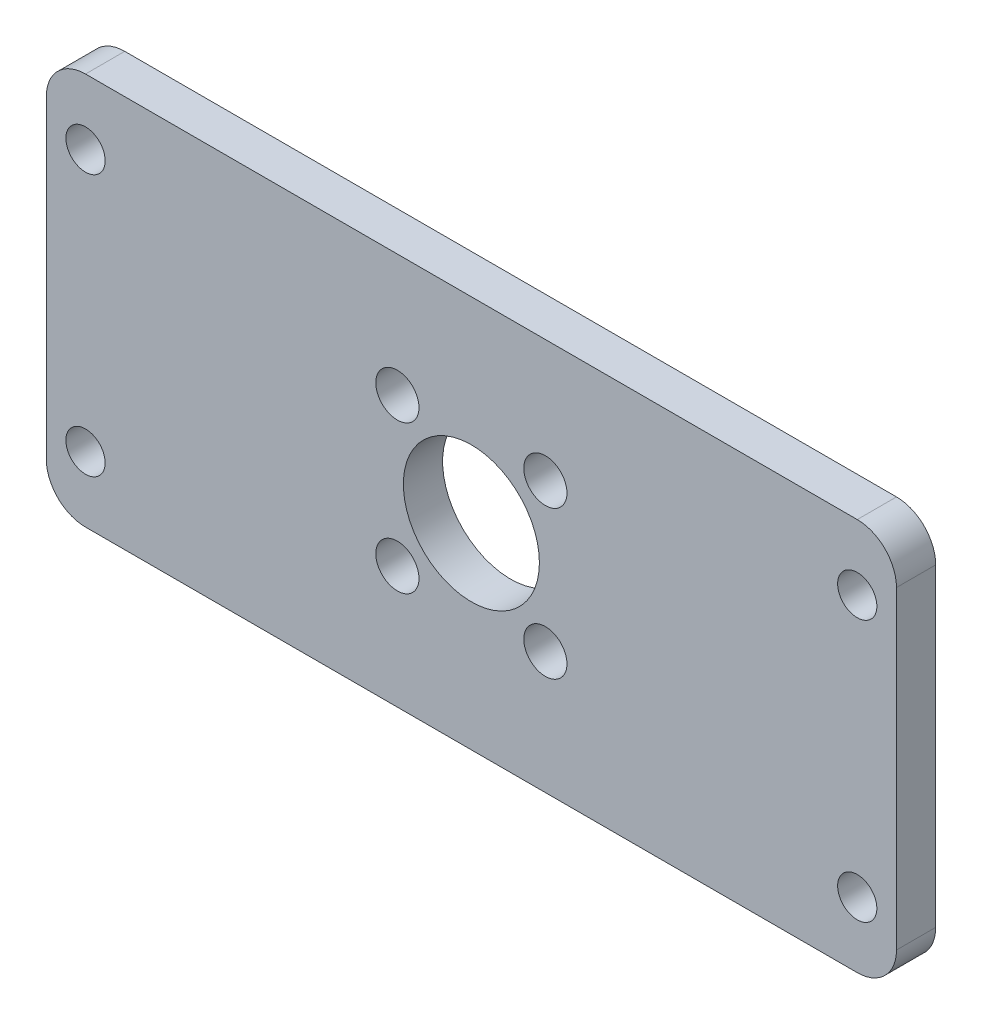
ISO-10303-21;
HEADER;
FILE_DESCRIPTION(('STEP AP214'),'2;1');
FILE_NAME('part.step','',(''),(''),'','','');
FILE_SCHEMA(('AUTOMOTIVE_DESIGN { 1 0 10303 214 1 1 1 1 }'));
ENDSEC;
DATA;
#1=APPLICATION_CONTEXT('core data for automotive mechanical design processes');
#2=APPLICATION_PROTOCOL_DEFINITION('international standard','automotive_design',2000,#1);
#3=PRODUCT_CONTEXT('',#1,'mechanical');
#4=PRODUCT('Part','Part','',(#3));
#5=PRODUCT_RELATED_PRODUCT_CATEGORY('part','',(#4));
#6=PRODUCT_DEFINITION_FORMATION('','',#4);
#7=PRODUCT_DEFINITION_CONTEXT('part definition',#1,'design');
#8=PRODUCT_DEFINITION('design','',#6,#7);
#9=PRODUCT_DEFINITION_SHAPE('','',#8);
#10=(LENGTH_UNIT() NAMED_UNIT(*) SI_UNIT(.MILLI.,.METRE.));
#11=(NAMED_UNIT(*) PLANE_ANGLE_UNIT() SI_UNIT($,.RADIAN.));
#12=(NAMED_UNIT(*) SI_UNIT($,.STERADIAN.) SOLID_ANGLE_UNIT());
#13=UNCERTAINTY_MEASURE_WITH_UNIT(LENGTH_MEASURE(1.E-05),#10,'distance_accuracy_value','');
#14=(GEOMETRIC_REPRESENTATION_CONTEXT(3) GLOBAL_UNCERTAINTY_ASSIGNED_CONTEXT((#13)) GLOBAL_UNIT_ASSIGNED_CONTEXT((#10,
#11,#12)) REPRESENTATION_CONTEXT('',''));
#15=CARTESIAN_POINT('',(0.,0.,0.));
#16=DIRECTION('',(0.,0.,1.));
#17=DIRECTION('',(1.,0.,0.));
#18=AXIS2_PLACEMENT_3D('',#15,#16,#17);
#19=CARTESIAN_POINT('',(0.,0.,3.));
#20=DIRECTION('',(0.,0.,-1.));
#21=DIRECTION('',(-1.,0.,0.));
#22=AXIS2_PLACEMENT_3D('',#19,#20,#21);
#23=PLANE('',#22);
#24=CARTESIAN_POINT('',(-29.5,10.,3.));
#25=DIRECTION('',(0.,0.,1.));
#26=DIRECTION('',(1.,0.,0.));
#27=AXIS2_PLACEMENT_3D('',#24,#25,#26);
#28=CIRCLE('',#27,1.5);
#29=CARTESIAN_POINT('',(-28.,10.,3.));
#30=VERTEX_POINT('',#29);
#31=EDGE_CURVE('E162',#30,#30,#28,.T.);
#32=ORIENTED_EDGE('',*,*,#31,.F.);
#33=EDGE_LOOP('',(#32));
#34=FACE_BOUND('',#33,.T.);
#35=CARTESIAN_POINT('',(-29.5,-10.,3.));
#36=DIRECTION('',(0.,0.,1.));
#37=DIRECTION('',(1.,0.,0.));
#38=AXIS2_PLACEMENT_3D('',#35,#36,#37);
#39=CIRCLE('',#38,1.5);
#40=CARTESIAN_POINT('',(-28.,-10.,3.));
#41=VERTEX_POINT('',#40);
#42=EDGE_CURVE('E156',#41,#41,#39,.T.);
#43=ORIENTED_EDGE('',*,*,#42,.F.);
#44=EDGE_LOOP('',(#43));
#45=FACE_BOUND('',#44,.T.);
#46=CARTESIAN_POINT('',(29.5,-10.,3.));
#47=DIRECTION('',(0.,0.,1.));
#48=DIRECTION('',(1.,0.,0.));
#49=AXIS2_PLACEMENT_3D('',#46,#47,#48);
#50=CIRCLE('',#49,1.5);
#51=CARTESIAN_POINT('',(31.,-10.,3.));
#52=VERTEX_POINT('',#51);
#53=EDGE_CURVE('E149',#52,#52,#50,.T.);
#54=ORIENTED_EDGE('',*,*,#53,.F.);
#55=EDGE_LOOP('',(#54));
#56=FACE_BOUND('',#55,.T.);
#57=CARTESIAN_POINT('',(29.5,10.,3.));
#58=DIRECTION('',(0.,0.,1.));
#59=DIRECTION('',(1.,0.,0.));
#60=AXIS2_PLACEMENT_3D('',#57,#58,#59);
#61=CIRCLE('',#60,1.5);
#62=CARTESIAN_POINT('',(31.,10.,3.));
#63=VERTEX_POINT('',#62);
#64=EDGE_CURVE('E152',#63,#63,#61,.T.);
#65=ORIENTED_EDGE('',*,*,#64,.F.);
#66=EDGE_LOOP('',(#65));
#67=FACE_BOUND('',#66,.T.);
#68=DIRECTION('',(0.,1.,0.));
#69=VECTOR('',#68,1.);
#70=CARTESIAN_POINT('',(32.5,-20.,3.));
#71=LINE('',#70,#69);
#72=CARTESIAN_POINT('',(32.5,-12.,3.));
#73=VERTEX_POINT('',#72);
#74=CARTESIAN_POINT('',(32.5,12.,3.));
#75=VERTEX_POINT('',#74);
#76=EDGE_CURVE('E203',#73,#75,#71,.T.);
#77=ORIENTED_EDGE('',*,*,#76,.T.);
#78=CARTESIAN_POINT('',(29.5,12.,3.));
#79=DIRECTION('',(0.,0.,-1.));
#80=DIRECTION('',(-1.,0.,0.));
#81=AXIS2_PLACEMENT_3D('',#78,#79,#80);
#82=CIRCLE('',#81,3.);
#83=CARTESIAN_POINT('',(29.5,15.,3.));
#84=VERTEX_POINT('',#83);
#85=EDGE_CURVE('E223',#75,#84,#82,.F.);
#86=ORIENTED_EDGE('',*,*,#85,.T.);
#87=DIRECTION('',(-1.,0.,0.));
#88=VECTOR('',#87,1.);
#89=CARTESIAN_POINT('',(0.,15.,3.));
#90=LINE('',#89,#88);
#91=CARTESIAN_POINT('',(-29.5,15.,3.));
#92=VERTEX_POINT('',#91);
#93=EDGE_CURVE('E133',#84,#92,#90,.T.);
#94=ORIENTED_EDGE('',*,*,#93,.T.);
#95=CARTESIAN_POINT('',(-29.5,12.,3.));
#96=DIRECTION('',(0.,0.,-1.));
#97=DIRECTION('',(-1.,0.,0.));
#98=AXIS2_PLACEMENT_3D('',#95,#96,#97);
#99=CIRCLE('',#98,3.);
#100=CARTESIAN_POINT('',(-32.5,12.,3.));
#101=VERTEX_POINT('',#100);
#102=EDGE_CURVE('E219',#92,#101,#99,.F.);
#103=ORIENTED_EDGE('',*,*,#102,.T.);
#104=DIRECTION('',(0.,-1.,0.));
#105=VECTOR('',#104,1.);
#106=CARTESIAN_POINT('',(-32.5,-20.,3.));
#107=LINE('',#106,#105);
#108=CARTESIAN_POINT('',(-32.5,-12.,3.));
#109=VERTEX_POINT('',#108);
#110=EDGE_CURVE('E206',#101,#109,#107,.T.);
#111=ORIENTED_EDGE('',*,*,#110,.T.);
#112=CARTESIAN_POINT('',(-29.5,-12.,3.));
#113=DIRECTION('',(0.,0.,-1.));
#114=DIRECTION('',(-1.,0.,0.));
#115=AXIS2_PLACEMENT_3D('',#112,#113,#114);
#116=CIRCLE('',#115,3.);
#117=CARTESIAN_POINT('',(-29.5,-15.,3.));
#118=VERTEX_POINT('',#117);
#119=EDGE_CURVE('E61',#109,#118,#116,.F.);
#120=ORIENTED_EDGE('',*,*,#119,.T.);
#121=DIRECTION('',(-1.,0.,0.));
#122=VECTOR('',#121,1.);
#123=CARTESIAN_POINT('',(-32.5,-15.,3.));
#124=LINE('',#123,#122);
#125=CARTESIAN_POINT('',(29.5,-15.,3.));
#126=VERTEX_POINT('',#125);
#127=EDGE_CURVE('E145',#126,#118,#124,.T.);
#128=ORIENTED_EDGE('',*,*,#127,.F.);
#129=CARTESIAN_POINT('',(29.5,-12.,3.));
#130=DIRECTION('',(0.,0.,-1.));
#131=DIRECTION('',(-1.,0.,0.));
#132=AXIS2_PLACEMENT_3D('',#129,#130,#131);
#133=CIRCLE('',#132,3.);
#134=EDGE_CURVE('E69',#126,#73,#133,.F.);
#135=ORIENTED_EDGE('',*,*,#134,.T.);
#136=EDGE_LOOP('',(#77,#86,#94,#103,#111,#120,#128,#135));
#137=FACE_BOUND('',#136,.T.);
#138=CARTESIAN_POINT('',(-5.65685424949237,5.65685424949239,3.));
#139=DIRECTION('',(0.,0.,1.));
#140=DIRECTION('',(1.,0.,0.));
#141=AXIS2_PLACEMENT_3D('',#138,#139,#140);
#142=CIRCLE('',#141,1.65);
#143=CARTESIAN_POINT('',(-4.00685424949237,5.65685424949239,3.));
#144=VERTEX_POINT('',#143);
#145=EDGE_CURVE('E197',#144,#144,#142,.T.);
#146=ORIENTED_EDGE('',*,*,#145,.F.);
#147=EDGE_LOOP('',(#146));
#148=FACE_BOUND('',#147,.T.);
#149=CARTESIAN_POINT('',(0.,0.,3.));
#150=DIRECTION('',(0.,0.,1.));
#151=DIRECTION('',(1.,0.,0.));
#152=AXIS2_PLACEMENT_3D('',#149,#150,#151);
#153=CIRCLE('',#152,5.2);
#154=CARTESIAN_POINT('',(5.2,0.,3.));
#155=VERTEX_POINT('',#154);
#156=EDGE_CURVE('E191',#155,#155,#153,.T.);
#157=ORIENTED_EDGE('',*,*,#156,.F.);
#158=EDGE_LOOP('',(#157));
#159=FACE_BOUND('',#158,.T.);
#160=CARTESIAN_POINT('',(5.65685424949239,5.65685424949237,3.));
#161=DIRECTION('',(0.,0.,1.));
#162=DIRECTION('',(1.,0.,0.));
#163=AXIS2_PLACEMENT_3D('',#160,#161,#162);
#164=CIRCLE('',#163,1.65);
#165=CARTESIAN_POINT('',(7.30685424949239,5.65685424949237,3.));
#166=VERTEX_POINT('',#165);
#167=EDGE_CURVE('E185',#166,#166,#164,.T.);
#168=ORIENTED_EDGE('',*,*,#167,.F.);
#169=EDGE_LOOP('',(#168));
#170=FACE_BOUND('',#169,.T.);
#171=CARTESIAN_POINT('',(5.65685424949237,-5.65685424949239,3.));
#172=DIRECTION('',(0.,0.,1.));
#173=DIRECTION('',(1.,0.,0.));
#174=AXIS2_PLACEMENT_3D('',#171,#172,#173);
#175=CIRCLE('',#174,1.65);
#176=CARTESIAN_POINT('',(7.30685424949237,-5.65685424949239,3.));
#177=VERTEX_POINT('',#176);
#178=EDGE_CURVE('E179',#177,#177,#175,.T.);
#179=ORIENTED_EDGE('',*,*,#178,.F.);
#180=EDGE_LOOP('',(#179));
#181=FACE_BOUND('',#180,.T.);
#182=CARTESIAN_POINT('',(-5.65685424949239,-5.65685424949237,3.));
#183=DIRECTION('',(0.,0.,1.));
#184=DIRECTION('',(1.,0.,0.));
#185=AXIS2_PLACEMENT_3D('',#182,#183,#184);
#186=CIRCLE('',#185,1.65);
#187=CARTESIAN_POINT('',(-4.00685424949239,-5.65685424949237,3.));
#188=VERTEX_POINT('',#187);
#189=EDGE_CURVE('E173',#188,#188,#186,.T.);
#190=ORIENTED_EDGE('',*,*,#189,.F.);
#191=EDGE_LOOP('',(#190));
#192=FACE_BOUND('',#191,.T.);
#193=ADVANCED_FACE('F46',(#34,#45,#56,#67,#137,#148,#159,#170,#181,#192),#23,.F.);
#194=CARTESIAN_POINT('',(0.,0.,0.));
#195=DIRECTION('',(0.,0.,-1.));
#196=DIRECTION('',(-1.,0.,0.));
#197=AXIS2_PLACEMENT_3D('',#194,#195,#196);
#198=PLANE('',#197);
#199=DIRECTION('',(-1.,0.,0.));
#200=VECTOR('',#199,1.);
#201=CARTESIAN_POINT('',(32.5,15.,0.));
#202=LINE('',#201,#200);
#203=CARTESIAN_POINT('',(29.5,15.,0.));
#204=VERTEX_POINT('',#203);
#205=CARTESIAN_POINT('',(-29.5,15.,0.));
#206=VERTEX_POINT('',#205);
#207=EDGE_CURVE('E130',#204,#206,#202,.T.);
#208=ORIENTED_EDGE('',*,*,#207,.F.);
#209=CARTESIAN_POINT('',(29.5,12.,0.));
#210=DIRECTION('',(0.,0.,-1.));
#211=DIRECTION('',(-1.,0.,0.));
#212=AXIS2_PLACEMENT_3D('',#209,#210,#211);
#213=CIRCLE('',#212,3.);
#214=CARTESIAN_POINT('',(32.5,12.,0.));
#215=VERTEX_POINT('',#214);
#216=EDGE_CURVE('E113',#204,#215,#213,.T.);
#217=ORIENTED_EDGE('',*,*,#216,.T.);
#218=DIRECTION('',(0.,1.,0.));
#219=VECTOR('',#218,1.);
#220=CARTESIAN_POINT('',(32.5,-20.,0.));
#221=LINE('',#220,#219);
#222=CARTESIAN_POINT('',(32.5,-12.,0.));
#223=VERTEX_POINT('',#222);
#224=EDGE_CURVE('E200',#223,#215,#221,.T.);
#225=ORIENTED_EDGE('',*,*,#224,.F.);
#226=CARTESIAN_POINT('',(29.5,-12.,0.));
#227=DIRECTION('',(0.,0.,-1.));
#228=DIRECTION('',(-1.,0.,0.));
#229=AXIS2_PLACEMENT_3D('',#226,#227,#228);
#230=CIRCLE('',#229,3.);
#231=CARTESIAN_POINT('',(29.5,-15.,0.));
#232=VERTEX_POINT('',#231);
#233=EDGE_CURVE('E124',#223,#232,#230,.T.);
#234=ORIENTED_EDGE('',*,*,#233,.T.);
#235=DIRECTION('',(1.,0.,0.));
#236=VECTOR('',#235,1.);
#237=CARTESIAN_POINT('',(0.,-15.,0.));
#238=LINE('',#237,#236);
#239=CARTESIAN_POINT('',(-29.5,-15.,0.));
#240=VERTEX_POINT('',#239);
#241=EDGE_CURVE('E140',#240,#232,#238,.T.);
#242=ORIENTED_EDGE('',*,*,#241,.F.);
#243=CARTESIAN_POINT('',(-29.5,-12.,0.));
#244=DIRECTION('',(0.,0.,-1.));
#245=DIRECTION('',(-1.,0.,0.));
#246=AXIS2_PLACEMENT_3D('',#243,#244,#245);
#247=CIRCLE('',#246,3.);
#248=CARTESIAN_POINT('',(-32.5,-12.,0.));
#249=VERTEX_POINT('',#248);
#250=EDGE_CURVE('E214',#240,#249,#247,.T.);
#251=ORIENTED_EDGE('',*,*,#250,.T.);
#252=DIRECTION('',(0.,-1.,0.));
#253=VECTOR('',#252,1.);
#254=CARTESIAN_POINT('',(-32.5,-20.,0.));
#255=LINE('',#254,#253);
#256=CARTESIAN_POINT('',(-32.5,12.,0.));
#257=VERTEX_POINT('',#256);
#258=EDGE_CURVE('E207',#257,#249,#255,.T.);
#259=ORIENTED_EDGE('',*,*,#258,.F.);
#260=CARTESIAN_POINT('',(-29.5,12.,0.));
#261=DIRECTION('',(0.,0.,-1.));
#262=DIRECTION('',(-1.,0.,0.));
#263=AXIS2_PLACEMENT_3D('',#260,#261,#262);
#264=CIRCLE('',#263,3.);
#265=EDGE_CURVE('E134',#257,#206,#264,.T.);
#266=ORIENTED_EDGE('',*,*,#265,.T.);
#267=EDGE_LOOP('',(#208,#217,#225,#234,#242,#251,#259,#266));
#268=FACE_BOUND('',#267,.T.);
#269=CARTESIAN_POINT('',(-29.5,10.,0.));
#270=DIRECTION('',(0.,0.,1.));
#271=DIRECTION('',(1.,0.,0.));
#272=AXIS2_PLACEMENT_3D('',#269,#270,#271);
#273=CIRCLE('',#272,1.5);
#274=CARTESIAN_POINT('',(-28.,10.,0.));
#275=VERTEX_POINT('',#274);
#276=EDGE_CURVE('E142',#275,#275,#273,.T.);
#277=ORIENTED_EDGE('',*,*,#276,.T.);
#278=EDGE_LOOP('',(#277));
#279=FACE_BOUND('',#278,.T.);
#280=CARTESIAN_POINT('',(-29.5,-10.,0.));
#281=DIRECTION('',(0.,0.,1.));
#282=DIRECTION('',(1.,0.,0.));
#283=AXIS2_PLACEMENT_3D('',#280,#281,#282);
#284=CIRCLE('',#283,1.5);
#285=CARTESIAN_POINT('',(-28.,-10.,0.));
#286=VERTEX_POINT('',#285);
#287=EDGE_CURVE('E159',#286,#286,#284,.T.);
#288=ORIENTED_EDGE('',*,*,#287,.T.);
#289=EDGE_LOOP('',(#288));
#290=FACE_BOUND('',#289,.T.);
#291=CARTESIAN_POINT('',(29.5,-10.,0.));
#292=DIRECTION('',(0.,0.,1.));
#293=DIRECTION('',(1.,0.,0.));
#294=AXIS2_PLACEMENT_3D('',#291,#292,#293);
#295=CIRCLE('',#294,1.5);
#296=CARTESIAN_POINT('',(31.,-10.,0.));
#297=VERTEX_POINT('',#296);
#298=EDGE_CURVE('E153',#297,#297,#295,.T.);
#299=ORIENTED_EDGE('',*,*,#298,.T.);
#300=EDGE_LOOP('',(#299));
#301=FACE_BOUND('',#300,.T.);
#302=CARTESIAN_POINT('',(29.5,10.,0.));
#303=DIRECTION('',(0.,0.,1.));
#304=DIRECTION('',(1.,0.,0.));
#305=AXIS2_PLACEMENT_3D('',#302,#303,#304);
#306=CIRCLE('',#305,1.5);
#307=CARTESIAN_POINT('',(31.,10.,0.));
#308=VERTEX_POINT('',#307);
#309=EDGE_CURVE('E167',#308,#308,#306,.T.);
#310=ORIENTED_EDGE('',*,*,#309,.T.);
#311=EDGE_LOOP('',(#310));
#312=FACE_BOUND('',#311,.T.);
#313=CARTESIAN_POINT('',(5.65685424949237,-5.65685424949239,0.));
#314=DIRECTION('',(0.,0.,1.));
#315=DIRECTION('',(1.,0.,0.));
#316=AXIS2_PLACEMENT_3D('',#313,#314,#315);
#317=CIRCLE('',#316,1.65);
#318=CARTESIAN_POINT('',(7.30685424949237,-5.65685424949239,0.));
#319=VERTEX_POINT('',#318);
#320=EDGE_CURVE('E176',#319,#319,#317,.T.);
#321=ORIENTED_EDGE('',*,*,#320,.T.);
#322=EDGE_LOOP('',(#321));
#323=FACE_BOUND('',#322,.T.);
#324=CARTESIAN_POINT('',(0.,0.,0.));
#325=DIRECTION('',(0.,0.,1.));
#326=DIRECTION('',(1.,0.,0.));
#327=AXIS2_PLACEMENT_3D('',#324,#325,#326);
#328=CIRCLE('',#327,5.2);
#329=CARTESIAN_POINT('',(5.2,0.,0.));
#330=VERTEX_POINT('',#329);
#331=EDGE_CURVE('E188',#330,#330,#328,.T.);
#332=ORIENTED_EDGE('',*,*,#331,.T.);
#333=EDGE_LOOP('',(#332));
#334=FACE_BOUND('',#333,.T.);
#335=CARTESIAN_POINT('',(-5.65685424949237,5.65685424949239,0.));
#336=DIRECTION('',(0.,0.,1.));
#337=DIRECTION('',(1.,0.,0.));
#338=AXIS2_PLACEMENT_3D('',#335,#336,#337);
#339=CIRCLE('',#338,1.65);
#340=CARTESIAN_POINT('',(-4.00685424949237,5.65685424949239,0.));
#341=VERTEX_POINT('',#340);
#342=EDGE_CURVE('E194',#341,#341,#339,.T.);
#343=ORIENTED_EDGE('',*,*,#342,.T.);
#344=EDGE_LOOP('',(#343));
#345=FACE_BOUND('',#344,.T.);
#346=CARTESIAN_POINT('',(5.65685424949239,5.65685424949237,0.));
#347=DIRECTION('',(0.,0.,1.));
#348=DIRECTION('',(1.,0.,0.));
#349=AXIS2_PLACEMENT_3D('',#346,#347,#348);
#350=CIRCLE('',#349,1.65);
#351=CARTESIAN_POINT('',(7.30685424949239,5.65685424949237,0.));
#352=VERTEX_POINT('',#351);
#353=EDGE_CURVE('E182',#352,#352,#350,.T.);
#354=ORIENTED_EDGE('',*,*,#353,.T.);
#355=EDGE_LOOP('',(#354));
#356=FACE_BOUND('',#355,.T.);
#357=CARTESIAN_POINT('',(-5.65685424949239,-5.65685424949237,0.));
#358=DIRECTION('',(0.,0.,1.));
#359=DIRECTION('',(1.,0.,0.));
#360=AXIS2_PLACEMENT_3D('',#357,#358,#359);
#361=CIRCLE('',#360,1.65);
#362=CARTESIAN_POINT('',(-4.00685424949239,-5.65685424949237,0.));
#363=VERTEX_POINT('',#362);
#364=EDGE_CURVE('E170',#363,#363,#361,.T.);
#365=ORIENTED_EDGE('',*,*,#364,.T.);
#366=EDGE_LOOP('',(#365));
#367=FACE_BOUND('',#366,.T.);
#368=ADVANCED_FACE('F137',(#268,#279,#290,#301,#312,#323,#334,#345,#356,#367),#198,.T.);
#369=CARTESIAN_POINT('',(32.5,-20.,3.));
#370=DIRECTION('',(-1.,0.,0.));
#371=DIRECTION('',(0.,0.,1.));
#372=AXIS2_PLACEMENT_3D('',#369,#370,#371);
#373=PLANE('',#372);
#374=ORIENTED_EDGE('',*,*,#224,.T.);
#375=DIRECTION('',(0.,0.,-1.));
#376=VECTOR('',#375,1.);
#377=CARTESIAN_POINT('',(32.5,12.,3.));
#378=LINE('',#377,#376);
#379=EDGE_CURVE('E118',#215,#75,#378,.F.);
#380=ORIENTED_EDGE('',*,*,#379,.T.);
#381=ORIENTED_EDGE('',*,*,#76,.F.);
#382=DIRECTION('',(0.,0.,1.));
#383=VECTOR('',#382,1.);
#384=CARTESIAN_POINT('',(32.5,-12.,3.));
#385=LINE('',#384,#383);
#386=EDGE_CURVE('E123',#73,#223,#385,.F.);
#387=ORIENTED_EDGE('',*,*,#386,.T.);
#388=EDGE_LOOP('',(#374,#380,#381,#387));
#389=FACE_BOUND('',#388,.T.);
#390=ADVANCED_FACE('F253',(#389),#373,.F.);
#391=CARTESIAN_POINT('',(-32.5,-20.,3.));
#392=DIRECTION('',(1.,0.,0.));
#393=DIRECTION('',(0.,0.,-1.));
#394=AXIS2_PLACEMENT_3D('',#391,#392,#393);
#395=PLANE('',#394);
#396=ORIENTED_EDGE('',*,*,#258,.T.);
#397=DIRECTION('',(0.,0.,1.));
#398=VECTOR('',#397,1.);
#399=CARTESIAN_POINT('',(-32.5,-12.,3.));
#400=LINE('',#399,#398);
#401=EDGE_CURVE('E11',#249,#109,#400,.T.);
#402=ORIENTED_EDGE('',*,*,#401,.T.);
#403=ORIENTED_EDGE('',*,*,#110,.F.);
#404=DIRECTION('',(0.,0.,-1.));
#405=VECTOR('',#404,1.);
#406=CARTESIAN_POINT('',(-32.5,12.,3.));
#407=LINE('',#406,#405);
#408=EDGE_CURVE('E54',#101,#257,#407,.T.);
#409=ORIENTED_EDGE('',*,*,#408,.T.);
#410=EDGE_LOOP('',(#396,#402,#403,#409));
#411=FACE_BOUND('',#410,.T.);
#412=ADVANCED_FACE('F232',(#411),#395,.F.);
#413=CARTESIAN_POINT('',(-5.65685424949237,5.65685424949239,3.));
#414=DIRECTION('',(0.,0.,-1.));
#415=DIRECTION('',(-1.,0.,0.));
#416=AXIS2_PLACEMENT_3D('',#413,#414,#415);
#417=CYLINDRICAL_SURFACE('',#416,1.65);
#418=ORIENTED_EDGE('',*,*,#145,.T.);
#419=EDGE_LOOP('',(#418));
#420=FACE_BOUND('',#419,.T.);
#421=ORIENTED_EDGE('',*,*,#342,.F.);
#422=EDGE_LOOP('',(#421));
#423=FACE_BOUND('',#422,.T.);
#424=ADVANCED_FACE('F258',(#420,#423),#417,.F.);
#425=CARTESIAN_POINT('',(0.,0.,3.));
#426=DIRECTION('',(0.,0.,-1.));
#427=DIRECTION('',(-1.,0.,0.));
#428=AXIS2_PLACEMENT_3D('',#425,#426,#427);
#429=CYLINDRICAL_SURFACE('',#428,5.2);
#430=ORIENTED_EDGE('',*,*,#156,.T.);
#431=EDGE_LOOP('',(#430));
#432=FACE_BOUND('',#431,.T.);
#433=ORIENTED_EDGE('',*,*,#331,.F.);
#434=EDGE_LOOP('',(#433));
#435=FACE_BOUND('',#434,.T.);
#436=ADVANCED_FACE('F308',(#432,#435),#429,.F.);
#437=CARTESIAN_POINT('',(5.65685424949239,5.65685424949237,3.));
#438=DIRECTION('',(0.,0.,-1.));
#439=DIRECTION('',(-1.,0.,0.));
#440=AXIS2_PLACEMENT_3D('',#437,#438,#439);
#441=CYLINDRICAL_SURFACE('',#440,1.65);
#442=ORIENTED_EDGE('',*,*,#167,.T.);
#443=EDGE_LOOP('',(#442));
#444=FACE_BOUND('',#443,.T.);
#445=ORIENTED_EDGE('',*,*,#353,.F.);
#446=EDGE_LOOP('',(#445));
#447=FACE_BOUND('',#446,.T.);
#448=ADVANCED_FACE('F305',(#444,#447),#441,.F.);
#449=CARTESIAN_POINT('',(5.65685424949237,-5.65685424949239,3.));
#450=DIRECTION('',(0.,0.,-1.));
#451=DIRECTION('',(-1.,0.,0.));
#452=AXIS2_PLACEMENT_3D('',#449,#450,#451);
#453=CYLINDRICAL_SURFACE('',#452,1.65);
#454=ORIENTED_EDGE('',*,*,#178,.T.);
#455=EDGE_LOOP('',(#454));
#456=FACE_BOUND('',#455,.T.);
#457=ORIENTED_EDGE('',*,*,#320,.F.);
#458=EDGE_LOOP('',(#457));
#459=FACE_BOUND('',#458,.T.);
#460=ADVANCED_FACE('F301',(#456,#459),#453,.F.);
#461=CARTESIAN_POINT('',(-5.65685424949239,-5.65685424949237,3.));
#462=DIRECTION('',(0.,0.,-1.));
#463=DIRECTION('',(-1.,0.,0.));
#464=AXIS2_PLACEMENT_3D('',#461,#462,#463);
#465=CYLINDRICAL_SURFACE('',#464,1.65);
#466=ORIENTED_EDGE('',*,*,#189,.T.);
#467=EDGE_LOOP('',(#466));
#468=FACE_BOUND('',#467,.T.);
#469=ORIENTED_EDGE('',*,*,#364,.F.);
#470=EDGE_LOOP('',(#469));
#471=FACE_BOUND('',#470,.T.);
#472=ADVANCED_FACE('F297',(#468,#471),#465,.F.);
#473=CARTESIAN_POINT('',(29.5,10.,0.));
#474=DIRECTION('',(0.,0.,1.));
#475=DIRECTION('',(1.,0.,0.));
#476=AXIS2_PLACEMENT_3D('',#473,#474,#475);
#477=CYLINDRICAL_SURFACE('',#476,1.5);
#478=ORIENTED_EDGE('',*,*,#309,.F.);
#479=EDGE_LOOP('',(#478));
#480=FACE_BOUND('',#479,.T.);
#481=ORIENTED_EDGE('',*,*,#64,.T.);
#482=EDGE_LOOP('',(#481));
#483=FACE_BOUND('',#482,.T.);
#484=ADVANCED_FACE('F287',(#480,#483),#477,.F.);
#485=CARTESIAN_POINT('',(29.5,-10.,0.));
#486=DIRECTION('',(0.,0.,1.));
#487=DIRECTION('',(1.,0.,0.));
#488=AXIS2_PLACEMENT_3D('',#485,#486,#487);
#489=CYLINDRICAL_SURFACE('',#488,1.5);
#490=ORIENTED_EDGE('',*,*,#298,.F.);
#491=EDGE_LOOP('',(#490));
#492=FACE_BOUND('',#491,.T.);
#493=ORIENTED_EDGE('',*,*,#53,.T.);
#494=EDGE_LOOP('',(#493));
#495=FACE_BOUND('',#494,.T.);
#496=ADVANCED_FACE('F283',(#492,#495),#489,.F.);
#497=CARTESIAN_POINT('',(-29.5,-10.,0.));
#498=DIRECTION('',(0.,0.,1.));
#499=DIRECTION('',(1.,0.,0.));
#500=AXIS2_PLACEMENT_3D('',#497,#498,#499);
#501=CYLINDRICAL_SURFACE('',#500,1.5);
#502=ORIENTED_EDGE('',*,*,#287,.F.);
#503=EDGE_LOOP('',(#502));
#504=FACE_BOUND('',#503,.T.);
#505=ORIENTED_EDGE('',*,*,#42,.T.);
#506=EDGE_LOOP('',(#505));
#507=FACE_BOUND('',#506,.T.);
#508=ADVANCED_FACE('F286',(#504,#507),#501,.F.);
#509=CARTESIAN_POINT('',(-29.5,10.,0.));
#510=DIRECTION('',(0.,0.,1.));
#511=DIRECTION('',(1.,0.,0.));
#512=AXIS2_PLACEMENT_3D('',#509,#510,#511);
#513=CYLINDRICAL_SURFACE('',#512,1.5);
#514=ORIENTED_EDGE('',*,*,#276,.F.);
#515=EDGE_LOOP('',(#514));
#516=FACE_BOUND('',#515,.T.);
#517=ORIENTED_EDGE('',*,*,#31,.T.);
#518=EDGE_LOOP('',(#517));
#519=FACE_BOUND('',#518,.T.);
#520=ADVANCED_FACE('F280',(#516,#519),#513,.F.);
#521=CARTESIAN_POINT('',(32.5,15.,10.));
#522=DIRECTION('',(0.,-1.,0.));
#523=DIRECTION('',(0.,0.,-1.));
#524=AXIS2_PLACEMENT_3D('',#521,#522,#523);
#525=PLANE('',#524);
#526=ORIENTED_EDGE('',*,*,#93,.F.);
#527=DIRECTION('',(0.,0.,-1.));
#528=VECTOR('',#527,1.);
#529=CARTESIAN_POINT('',(29.5,15.,10.));
#530=LINE('',#529,#528);
#531=EDGE_CURVE('E117',#84,#204,#530,.T.);
#532=ORIENTED_EDGE('',*,*,#531,.T.);
#533=ORIENTED_EDGE('',*,*,#207,.T.);
#534=DIRECTION('',(0.,0.,-1.));
#535=VECTOR('',#534,1.);
#536=CARTESIAN_POINT('',(-29.5,15.,10.));
#537=LINE('',#536,#535);
#538=EDGE_CURVE('E135',#206,#92,#537,.F.);
#539=ORIENTED_EDGE('',*,*,#538,.T.);
#540=EDGE_LOOP('',(#526,#532,#533,#539));
#541=FACE_BOUND('',#540,.T.);
#542=ADVANCED_FACE('F129',(#541),#525,.F.);
#543=CARTESIAN_POINT('',(-32.5,-15.,-7.));
#544=DIRECTION('',(0.,1.,0.));
#545=DIRECTION('',(0.,0.,1.));
#546=AXIS2_PLACEMENT_3D('',#543,#544,#545);
#547=PLANE('',#546);
#548=ORIENTED_EDGE('',*,*,#241,.T.);
#549=DIRECTION('',(0.,0.,1.));
#550=VECTOR('',#549,1.);
#551=CARTESIAN_POINT('',(29.5,-15.,-7.));
#552=LINE('',#551,#550);
#553=EDGE_CURVE('E227',#232,#126,#552,.T.);
#554=ORIENTED_EDGE('',*,*,#553,.T.);
#555=ORIENTED_EDGE('',*,*,#127,.T.);
#556=DIRECTION('',(0.,0.,1.));
#557=VECTOR('',#556,1.);
#558=CARTESIAN_POINT('',(-29.5,-15.,-7.));
#559=LINE('',#558,#557);
#560=EDGE_CURVE('E225',#118,#240,#559,.F.);
#561=ORIENTED_EDGE('',*,*,#560,.T.);
#562=EDGE_LOOP('',(#548,#554,#555,#561));
#563=FACE_BOUND('',#562,.T.);
#564=ADVANCED_FACE('F268',(#563),#547,.F.);
#565=CARTESIAN_POINT('',(29.5,12.,10.));
#566=DIRECTION('',(0.,0.,-1.));
#567=DIRECTION('',(-1.,0.,0.));
#568=AXIS2_PLACEMENT_3D('',#565,#566,#567);
#569=CYLINDRICAL_SURFACE('',#568,3.);
#570=ORIENTED_EDGE('',*,*,#85,.F.);
#571=ORIENTED_EDGE('',*,*,#379,.F.);
#572=ORIENTED_EDGE('',*,*,#216,.F.);
#573=ORIENTED_EDGE('',*,*,#531,.F.);
#574=EDGE_LOOP('',(#570,#571,#572,#573));
#575=FACE_BOUND('',#574,.T.);
#576=ADVANCED_FACE('F116',(#575),#569,.T.);
#577=CARTESIAN_POINT('',(29.5,-12.,-7.));
#578=DIRECTION('',(0.,0.,1.));
#579=DIRECTION('',(1.,0.,0.));
#580=AXIS2_PLACEMENT_3D('',#577,#578,#579);
#581=CYLINDRICAL_SURFACE('',#580,3.);
#582=ORIENTED_EDGE('',*,*,#233,.F.);
#583=ORIENTED_EDGE('',*,*,#386,.F.);
#584=ORIENTED_EDGE('',*,*,#134,.F.);
#585=ORIENTED_EDGE('',*,*,#553,.F.);
#586=EDGE_LOOP('',(#582,#583,#584,#585));
#587=FACE_BOUND('',#586,.T.);
#588=ADVANCED_FACE('F246',(#587),#581,.T.);
#589=CARTESIAN_POINT('',(-29.5,-12.,3.));
#590=DIRECTION('',(0.,0.,1.));
#591=DIRECTION('',(1.,0.,0.));
#592=AXIS2_PLACEMENT_3D('',#589,#590,#591);
#593=CYLINDRICAL_SURFACE('',#592,3.);
#594=ORIENTED_EDGE('',*,*,#250,.F.);
#595=ORIENTED_EDGE('',*,*,#560,.F.);
#596=ORIENTED_EDGE('',*,*,#119,.F.);
#597=ORIENTED_EDGE('',*,*,#401,.F.);
#598=EDGE_LOOP('',(#594,#595,#596,#597));
#599=FACE_BOUND('',#598,.T.);
#600=ADVANCED_FACE('F240',(#599),#593,.T.);
#601=CARTESIAN_POINT('',(-29.5,12.,3.));
#602=DIRECTION('',(0.,0.,-1.));
#603=DIRECTION('',(-1.,0.,0.));
#604=AXIS2_PLACEMENT_3D('',#601,#602,#603);
#605=CYLINDRICAL_SURFACE('',#604,3.);
#606=ORIENTED_EDGE('',*,*,#102,.F.);
#607=ORIENTED_EDGE('',*,*,#538,.F.);
#608=ORIENTED_EDGE('',*,*,#265,.F.);
#609=ORIENTED_EDGE('',*,*,#408,.F.);
#610=EDGE_LOOP('',(#606,#607,#608,#609));
#611=FACE_BOUND('',#610,.T.);
#612=ADVANCED_FACE('F48',(#611),#605,.T.);
#613=CLOSED_SHELL('',(#193,#368,#390,#412,#424,#436,#448,#460,#472,#484,#496,#508,#520,#542,
#564,#576,#588,#600,#612));
#614=MANIFOLD_SOLID_BREP('B2',#613);
#615=ADVANCED_BREP_SHAPE_REPRESENTATION('',(#18,#614),#14);
#616=SHAPE_DEFINITION_REPRESENTATION(#9,#615);
ENDSEC;
END-ISO-10303-21;
